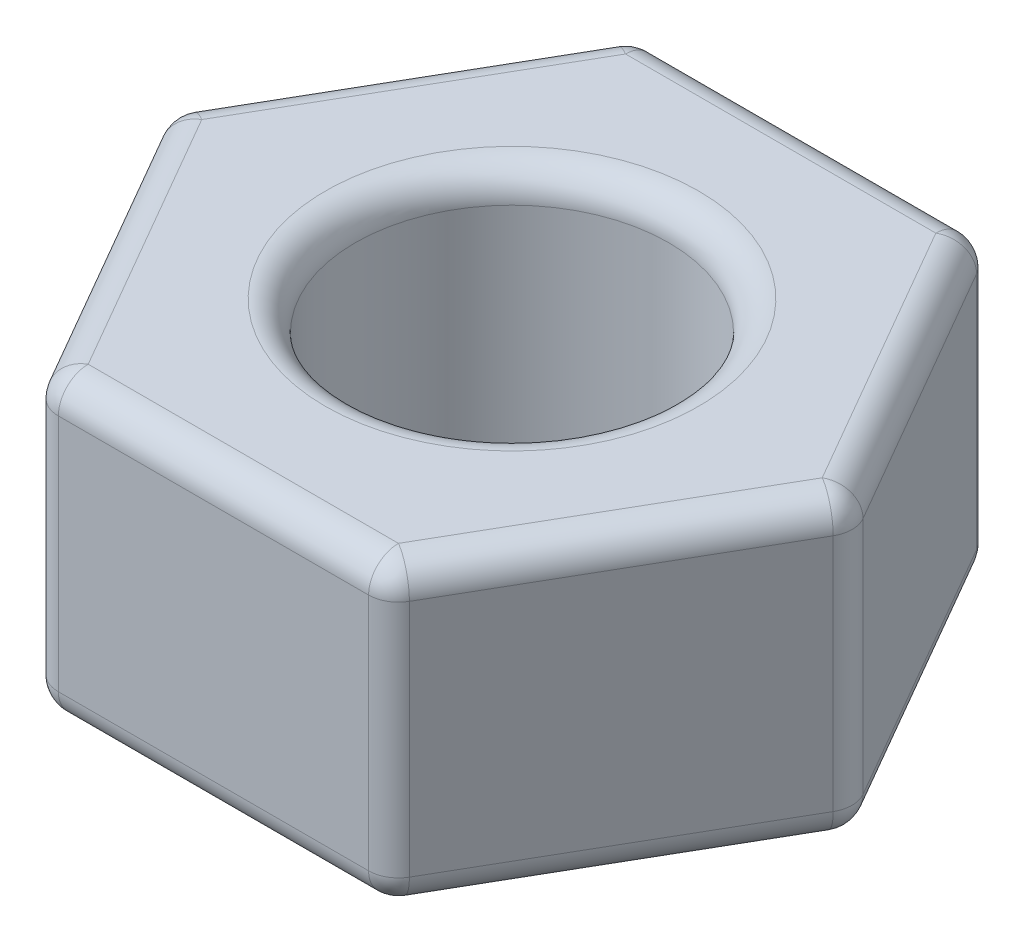
ISO-10303-21;
HEADER;
FILE_DESCRIPTION(('STEP AP214'),'2;1');
FILE_NAME('part.step','',(''),(''),'','','');
FILE_SCHEMA(('AUTOMOTIVE_DESIGN { 1 0 10303 214 1 1 1 1 }'));
ENDSEC;
DATA;
#1=APPLICATION_CONTEXT('core data for automotive mechanical design processes');
#2=APPLICATION_PROTOCOL_DEFINITION('international standard','automotive_design',2000,#1);
#3=PRODUCT_CONTEXT('',#1,'mechanical');
#4=PRODUCT('Part','Part','',(#3));
#5=PRODUCT_RELATED_PRODUCT_CATEGORY('part','',(#4));
#6=PRODUCT_DEFINITION_FORMATION('','',#4);
#7=PRODUCT_DEFINITION_CONTEXT('part definition',#1,'design');
#8=PRODUCT_DEFINITION('design','',#6,#7);
#9=PRODUCT_DEFINITION_SHAPE('','',#8);
#10=(LENGTH_UNIT() NAMED_UNIT(*) SI_UNIT(.MILLI.,.METRE.));
#11=(NAMED_UNIT(*) PLANE_ANGLE_UNIT() SI_UNIT($,.RADIAN.));
#12=(NAMED_UNIT(*) SI_UNIT($,.STERADIAN.) SOLID_ANGLE_UNIT());
#13=UNCERTAINTY_MEASURE_WITH_UNIT(LENGTH_MEASURE(1.E-05),#10,'distance_accuracy_value','');
#14=(GEOMETRIC_REPRESENTATION_CONTEXT(3) GLOBAL_UNCERTAINTY_ASSIGNED_CONTEXT((#13)) GLOBAL_UNIT_ASSIGNED_CONTEXT((#10,
#11,#12)) REPRESENTATION_CONTEXT('',''));
#15=CARTESIAN_POINT('',(0.,0.,0.));
#16=DIRECTION('',(0.,0.,1.));
#17=DIRECTION('',(1.,0.,0.));
#18=AXIS2_PLACEMENT_3D('',#15,#16,#17);
#19=CARTESIAN_POINT('',(4.61880215351701,4.,0.));
#20=DIRECTION('',(-0.866025403784439,0.,0.5));
#21=DIRECTION('',(0.5,0.,0.866025403784439));
#22=AXIS2_PLACEMENT_3D('',#19,#20,#21);
#23=PLANE('',#22);
#24=DIRECTION('',(0.,-1.,0.));
#25=VECTOR('',#24,1.);
#26=CARTESIAN_POINT('',(2.42487113059643,4.,-3.8));
#27=LINE('',#26,#25);
#28=CARTESIAN_POINT('',(2.42487113059643,0.4,-3.8));
#29=VERTEX_POINT('',#28);
#30=CARTESIAN_POINT('',(2.42487113059643,3.6,-3.8));
#31=VERTEX_POINT('',#30);
#32=EDGE_CURVE('E255',#29,#31,#27,.F.);
#33=ORIENTED_EDGE('',*,*,#32,.T.);
#34=DIRECTION('',(-0.5,0.,-0.866025403784439));
#35=VECTOR('',#34,1.);
#36=CARTESIAN_POINT('',(4.61880215351701,3.6,0.));
#37=LINE('',#36,#35);
#38=CARTESIAN_POINT('',(4.50333209967908,3.6,-0.200000000000002));
#39=VERTEX_POINT('',#38);
#40=EDGE_CURVE('E257',#31,#39,#37,.F.);
#41=ORIENTED_EDGE('',*,*,#40,.T.);
#42=DIRECTION('',(0.,-1.,0.));
#43=VECTOR('',#42,1.);
#44=CARTESIAN_POINT('',(4.50333209967908,4.,-0.200000000000002));
#45=LINE('',#44,#43);
#46=CARTESIAN_POINT('',(4.50333209967908,0.4,-0.200000000000002));
#47=VERTEX_POINT('',#46);
#48=EDGE_CURVE('E253',#39,#47,#45,.T.);
#49=ORIENTED_EDGE('',*,*,#48,.T.);
#50=DIRECTION('',(-0.5,0.,-0.866025403784439));
#51=VECTOR('',#50,1.);
#52=CARTESIAN_POINT('',(4.61880215351701,0.4,0.));
#53=LINE('',#52,#51);
#54=EDGE_CURVE('E251',#47,#29,#53,.T.);
#55=ORIENTED_EDGE('',*,*,#54,.T.);
#56=EDGE_LOOP('',(#33,#41,#49,#55));
#57=FACE_BOUND('',#56,.T.);
#58=ADVANCED_FACE('F41',(#57),#23,.F.);
#59=CARTESIAN_POINT('',(2.3094010767585,4.,-4.));
#60=DIRECTION('',(0.,0.,1.));
#61=DIRECTION('',(1.,0.,0.));
#62=AXIS2_PLACEMENT_3D('',#59,#60,#61);
#63=PLANE('',#62);
#64=DIRECTION('',(0.,-1.,0.));
#65=VECTOR('',#64,1.);
#66=CARTESIAN_POINT('',(-2.07846096908265,4.,-4.));
#67=LINE('',#66,#65);
#68=CARTESIAN_POINT('',(-2.07846096908265,0.4,-4.));
#69=VERTEX_POINT('',#68);
#70=CARTESIAN_POINT('',(-2.07846096908265,3.6,-4.));
#71=VERTEX_POINT('',#70);
#72=EDGE_CURVE('E246',#69,#71,#67,.F.);
#73=ORIENTED_EDGE('',*,*,#72,.T.);
#74=DIRECTION('',(-1.,0.,0.));
#75=VECTOR('',#74,1.);
#76=CARTESIAN_POINT('',(2.3094010767585,3.6,-4.));
#77=LINE('',#76,#75);
#78=CARTESIAN_POINT('',(2.07846096908265,3.6,-4.));
#79=VERTEX_POINT('',#78);
#80=EDGE_CURVE('E248',#71,#79,#77,.F.);
#81=ORIENTED_EDGE('',*,*,#80,.T.);
#82=DIRECTION('',(0.,-1.,0.));
#83=VECTOR('',#82,1.);
#84=CARTESIAN_POINT('',(2.07846096908265,4.,-4.));
#85=LINE('',#84,#83);
#86=CARTESIAN_POINT('',(2.07846096908265,0.4,-4.));
#87=VERTEX_POINT('',#86);
#88=EDGE_CURVE('E244',#79,#87,#85,.T.);
#89=ORIENTED_EDGE('',*,*,#88,.T.);
#90=DIRECTION('',(-1.,0.,0.));
#91=VECTOR('',#90,1.);
#92=CARTESIAN_POINT('',(2.3094010767585,0.4,-4.));
#93=LINE('',#92,#91);
#94=EDGE_CURVE('E242',#87,#69,#93,.T.);
#95=ORIENTED_EDGE('',*,*,#94,.T.);
#96=EDGE_LOOP('',(#73,#81,#89,#95));
#97=FACE_BOUND('',#96,.T.);
#98=ADVANCED_FACE('F383',(#97),#63,.F.);
#99=CARTESIAN_POINT('',(-2.3094010767585,4.,-4.));
#100=DIRECTION('',(0.866025403784439,0.,0.499999999999999));
#101=DIRECTION('',(0.5,0.,-0.866025403784439));
#102=AXIS2_PLACEMENT_3D('',#99,#100,#101);
#103=PLANE('',#102);
#104=DIRECTION('',(-0.5,0.,0.866025403784439));
#105=VECTOR('',#104,1.);
#106=CARTESIAN_POINT('',(-2.3094010767585,0.4,-4.));
#107=LINE('',#106,#105);
#108=CARTESIAN_POINT('',(-2.42487113059643,0.4,-3.8));
#109=VERTEX_POINT('',#108);
#110=CARTESIAN_POINT('',(-4.50333209967908,0.4,-0.199999999999999));
#111=VERTEX_POINT('',#110);
#112=EDGE_CURVE('E211',#109,#111,#107,.T.);
#113=ORIENTED_EDGE('',*,*,#112,.T.);
#114=DIRECTION('',(0.,-1.,0.));
#115=VECTOR('',#114,1.);
#116=CARTESIAN_POINT('',(-4.50333209967908,4.,-0.199999999999999));
#117=LINE('',#116,#115);
#118=CARTESIAN_POINT('',(-4.50333209967908,3.6,-0.199999999999999));
#119=VERTEX_POINT('',#118);
#120=EDGE_CURVE('E217',#111,#119,#117,.F.);
#121=ORIENTED_EDGE('',*,*,#120,.T.);
#122=DIRECTION('',(-0.5,0.,0.866025403784439));
#123=VECTOR('',#122,1.);
#124=CARTESIAN_POINT('',(-2.3094010767585,3.6,-4.));
#125=LINE('',#124,#123);
#126=CARTESIAN_POINT('',(-2.42487113059643,3.6,-3.8));
#127=VERTEX_POINT('',#126);
#128=EDGE_CURVE('E215',#119,#127,#125,.F.);
#129=ORIENTED_EDGE('',*,*,#128,.T.);
#130=DIRECTION('',(0.,-1.,0.));
#131=VECTOR('',#130,1.);
#132=CARTESIAN_POINT('',(-2.42487113059643,4.,-3.8));
#133=LINE('',#132,#131);
#134=EDGE_CURVE('E213',#127,#109,#133,.T.);
#135=ORIENTED_EDGE('',*,*,#134,.T.);
#136=EDGE_LOOP('',(#113,#121,#129,#135));
#137=FACE_BOUND('',#136,.T.);
#138=ADVANCED_FACE('F446',(#137),#103,.F.);
#139=CARTESIAN_POINT('',(-4.618802153517,4.,0.));
#140=DIRECTION('',(0.866025403784439,0.,-0.5));
#141=DIRECTION('',(-0.5,0.,-0.866025403784439));
#142=AXIS2_PLACEMENT_3D('',#139,#140,#141);
#143=PLANE('',#142);
#144=DIRECTION('',(0.,-1.,0.));
#145=VECTOR('',#144,1.);
#146=CARTESIAN_POINT('',(-2.42487113059643,4.,3.8));
#147=LINE('',#146,#145);
#148=CARTESIAN_POINT('',(-2.42487113059643,0.4,3.8));
#149=VERTEX_POINT('',#148);
#150=CARTESIAN_POINT('',(-2.42487113059643,3.6,3.8));
#151=VERTEX_POINT('',#150);
#152=EDGE_CURVE('E172',#149,#151,#147,.F.);
#153=ORIENTED_EDGE('',*,*,#152,.T.);
#154=DIRECTION('',(0.5,0.,0.866025403784439));
#155=VECTOR('',#154,1.);
#156=CARTESIAN_POINT('',(-4.618802153517,3.6,0.));
#157=LINE('',#156,#155);
#158=CARTESIAN_POINT('',(-4.50333209967908,3.6,0.200000000000001));
#159=VERTEX_POINT('',#158);
#160=EDGE_CURVE('E209',#151,#159,#157,.F.);
#161=ORIENTED_EDGE('',*,*,#160,.T.);
#162=DIRECTION('',(0.,-1.,0.));
#163=VECTOR('',#162,1.);
#164=CARTESIAN_POINT('',(-4.50333209967908,4.,0.200000000000001));
#165=LINE('',#164,#163);
#166=CARTESIAN_POINT('',(-4.50333209967908,0.4,0.200000000000001));
#167=VERTEX_POINT('',#166);
#168=EDGE_CURVE('E202',#159,#167,#165,.T.);
#169=ORIENTED_EDGE('',*,*,#168,.T.);
#170=DIRECTION('',(0.5,0.,0.866025403784439));
#171=VECTOR('',#170,1.);
#172=CARTESIAN_POINT('',(-4.618802153517,0.4,0.));
#173=LINE('',#172,#171);
#174=EDGE_CURVE('E200',#167,#149,#173,.T.);
#175=ORIENTED_EDGE('',*,*,#174,.T.);
#176=EDGE_LOOP('',(#153,#161,#169,#175));
#177=FACE_BOUND('',#176,.T.);
#178=ADVANCED_FACE('F799',(#177),#143,.F.);
#179=CARTESIAN_POINT('',(-2.3094010767585,4.,4.));
#180=DIRECTION('',(0.,0.,-1.));
#181=DIRECTION('',(-1.,0.,0.));
#182=AXIS2_PLACEMENT_3D('',#179,#180,#181);
#183=PLANE('',#182);
#184=DIRECTION('',(1.,0.,0.));
#185=VECTOR('',#184,1.);
#186=CARTESIAN_POINT('',(-2.3094010767585,3.6,4.));
#187=LINE('',#186,#185);
#188=CARTESIAN_POINT('',(2.07846096908265,3.6,4.));
#189=VERTEX_POINT('',#188);
#190=CARTESIAN_POINT('',(-2.07846096908265,3.6,4.));
#191=VERTEX_POINT('',#190);
#192=EDGE_CURVE('E198',#189,#191,#187,.F.);
#193=ORIENTED_EDGE('',*,*,#192,.T.);
#194=DIRECTION('',(0.,-1.,0.));
#195=VECTOR('',#194,1.);
#196=CARTESIAN_POINT('',(-2.07846096908265,4.,4.));
#197=LINE('',#196,#195);
#198=CARTESIAN_POINT('',(-2.07846096908265,0.4,4.));
#199=VERTEX_POINT('',#198);
#200=EDGE_CURVE('E170',#191,#199,#197,.T.);
#201=ORIENTED_EDGE('',*,*,#200,.T.);
#202=DIRECTION('',(1.,0.,0.));
#203=VECTOR('',#202,1.);
#204=CARTESIAN_POINT('',(-2.3094010767585,0.4,4.));
#205=LINE('',#204,#203);
#206=CARTESIAN_POINT('',(2.07846096908265,0.4,4.));
#207=VERTEX_POINT('',#206);
#208=EDGE_CURVE('E188',#199,#207,#205,.T.);
#209=ORIENTED_EDGE('',*,*,#208,.T.);
#210=DIRECTION('',(0.,-1.,0.));
#211=VECTOR('',#210,1.);
#212=CARTESIAN_POINT('',(2.07846096908265,4.,4.));
#213=LINE('',#212,#211);
#214=EDGE_CURVE('E194',#207,#189,#213,.F.);
#215=ORIENTED_EDGE('',*,*,#214,.T.);
#216=EDGE_LOOP('',(#193,#201,#209,#215));
#217=FACE_BOUND('',#216,.T.);
#218=ADVANCED_FACE('F196',(#217),#183,.F.);
#219=CARTESIAN_POINT('',(2.3094010767585,4.,4.));
#220=DIRECTION('',(-0.866025403784439,0.,-0.5));
#221=DIRECTION('',(-0.5,0.,0.866025403784439));
#222=AXIS2_PLACEMENT_3D('',#219,#220,#221);
#223=PLANE('',#222);
#224=DIRECTION('',(0.5,0.,-0.866025403784439));
#225=VECTOR('',#224,1.);
#226=CARTESIAN_POINT('',(2.3094010767585,3.6,4.));
#227=LINE('',#226,#225);
#228=CARTESIAN_POINT('',(4.50333209967908,3.6,0.199999999999999));
#229=VERTEX_POINT('',#228);
#230=CARTESIAN_POINT('',(2.42487113059643,3.6,3.8));
#231=VERTEX_POINT('',#230);
#232=EDGE_CURVE('E264',#229,#231,#227,.F.);
#233=ORIENTED_EDGE('',*,*,#232,.T.);
#234=DIRECTION('',(0.,-1.,0.));
#235=VECTOR('',#234,1.);
#236=CARTESIAN_POINT('',(2.42487113059643,4.,3.8));
#237=LINE('',#236,#235);
#238=CARTESIAN_POINT('',(2.42487113059643,0.4,3.8));
#239=VERTEX_POINT('',#238);
#240=EDGE_CURVE('E266',#231,#239,#237,.T.);
#241=ORIENTED_EDGE('',*,*,#240,.T.);
#242=DIRECTION('',(0.5,0.,-0.866025403784439));
#243=VECTOR('',#242,1.);
#244=CARTESIAN_POINT('',(2.3094010767585,0.4,4.));
#245=LINE('',#244,#243);
#246=CARTESIAN_POINT('',(4.50333209967908,0.4,0.199999999999999));
#247=VERTEX_POINT('',#246);
#248=EDGE_CURVE('E260',#239,#247,#245,.T.);
#249=ORIENTED_EDGE('',*,*,#248,.T.);
#250=DIRECTION('',(0.,-1.,0.));
#251=VECTOR('',#250,1.);
#252=CARTESIAN_POINT('',(4.50333209967908,4.,0.199999999999999));
#253=LINE('',#252,#251);
#254=EDGE_CURVE('E262',#247,#229,#253,.F.);
#255=ORIENTED_EDGE('',*,*,#254,.T.);
#256=EDGE_LOOP('',(#233,#241,#249,#255));
#257=FACE_BOUND('',#256,.T.);
#258=ADVANCED_FACE('F782',(#257),#223,.F.);
#259=CARTESIAN_POINT('',(0.,4.,0.));
#260=DIRECTION('',(0.,1.,0.));
#261=DIRECTION('',(0.,0.,1.));
#262=AXIS2_PLACEMENT_3D('',#259,#260,#261);
#263=PLANE('',#262);
#264=CARTESIAN_POINT('',(0.,4.,0.));
#265=DIRECTION('',(0.,1.,0.));
#266=DIRECTION('',(0.,0.,1.));
#267=AXIS2_PLACEMENT_3D('',#264,#265,#266);
#268=CIRCLE('',#267,2.5);
#269=CARTESIAN_POINT('',(0.,4.,2.5));
#270=VERTEX_POINT('',#269);
#271=EDGE_CURVE('E233',#270,#270,#268,.F.);
#272=ORIENTED_EDGE('',*,*,#271,.T.);
#273=EDGE_LOOP('',(#272));
#274=FACE_BOUND('',#273,.T.);
#275=DIRECTION('',(0.5,0.,0.866025403784439));
#276=VECTOR('',#275,1.);
#277=CARTESIAN_POINT('',(-1.96299091524473,4.,3.8));
#278=LINE('',#277,#276);
#279=CARTESIAN_POINT('',(-4.1569219381653,4.,0.));
#280=VERTEX_POINT('',#279);
#281=CARTESIAN_POINT('',(-2.07846096908265,4.,3.6));
#282=VERTEX_POINT('',#281);
#283=EDGE_CURVE('E228',#280,#282,#278,.T.);
#284=ORIENTED_EDGE('',*,*,#283,.T.);
#285=DIRECTION('',(1.,0.,0.));
#286=VECTOR('',#285,1.);
#287=CARTESIAN_POINT('',(2.3094010767585,4.,3.6));
#288=LINE('',#287,#286);
#289=CARTESIAN_POINT('',(2.07846096908265,4.,3.6));
#290=VERTEX_POINT('',#289);
#291=EDGE_CURVE('E230',#282,#290,#288,.T.);
#292=ORIENTED_EDGE('',*,*,#291,.T.);
#293=DIRECTION('',(0.5,0.,-0.866025403784439));
#294=VECTOR('',#293,1.);
#295=CARTESIAN_POINT('',(4.27239199200323,4.,-0.200000000000002));
#296=LINE('',#295,#294);
#297=CARTESIAN_POINT('',(4.15692193816531,4.,0.));
#298=VERTEX_POINT('',#297);
#299=EDGE_CURVE('E220',#290,#298,#296,.T.);
#300=ORIENTED_EDGE('',*,*,#299,.T.);
#301=DIRECTION('',(-0.5,0.,-0.866025403784439));
#302=VECTOR('',#301,1.);
#303=CARTESIAN_POINT('',(1.96299091524473,4.,-3.8));
#304=LINE('',#303,#302);
#305=CARTESIAN_POINT('',(2.07846096908265,4.,-3.6));
#306=VERTEX_POINT('',#305);
#307=EDGE_CURVE('E222',#298,#306,#304,.T.);
#308=ORIENTED_EDGE('',*,*,#307,.T.);
#309=DIRECTION('',(-1.,0.,0.));
#310=VECTOR('',#309,1.);
#311=CARTESIAN_POINT('',(-2.3094010767585,4.,-3.6));
#312=LINE('',#311,#310);
#313=CARTESIAN_POINT('',(-2.07846096908265,4.,-3.6));
#314=VERTEX_POINT('',#313);
#315=EDGE_CURVE('E224',#306,#314,#312,.T.);
#316=ORIENTED_EDGE('',*,*,#315,.T.);
#317=DIRECTION('',(-0.5,0.,0.866025403784439));
#318=VECTOR('',#317,1.);
#319=CARTESIAN_POINT('',(-4.27239199200323,4.,0.200000000000002));
#320=LINE('',#319,#318);
#321=EDGE_CURVE('E226',#314,#280,#320,.T.);
#322=ORIENTED_EDGE('',*,*,#321,.T.);
#323=EDGE_LOOP('',(#284,#292,#300,#308,#316,#322));
#324=FACE_BOUND('',#323,.T.);
#325=ADVANCED_FACE('F404',(#274,#324),#263,.T.);
#326=CARTESIAN_POINT('',(0.,0.,0.));
#327=DIRECTION('',(0.,1.,0.));
#328=DIRECTION('',(0.,0.,1.));
#329=AXIS2_PLACEMENT_3D('',#326,#327,#328);
#330=PLANE('',#329);
#331=DIRECTION('',(-0.5,0.,0.866025403784439));
#332=VECTOR('',#331,1.);
#333=CARTESIAN_POINT('',(-3.11769145362398,0.,-1.8));
#334=LINE('',#333,#332);
#335=CARTESIAN_POINT('',(-4.1569219381653,0.,0.));
#336=VERTEX_POINT('',#335);
#337=CARTESIAN_POINT('',(-2.07846096908265,0.,-3.6));
#338=VERTEX_POINT('',#337);
#339=EDGE_CURVE('E50',#336,#338,#334,.F.);
#340=ORIENTED_EDGE('',*,*,#339,.T.);
#341=DIRECTION('',(-1.,0.,0.));
#342=VECTOR('',#341,1.);
#343=CARTESIAN_POINT('',(0.,0.,-3.6));
#344=LINE('',#343,#342);
#345=CARTESIAN_POINT('',(2.07846096908265,0.,-3.6));
#346=VERTEX_POINT('',#345);
#347=EDGE_CURVE('E11',#338,#346,#344,.F.);
#348=ORIENTED_EDGE('',*,*,#347,.T.);
#349=DIRECTION('',(-0.5,0.,-0.866025403784439));
#350=VECTOR('',#349,1.);
#351=CARTESIAN_POINT('',(3.11769145362398,0.,-1.8));
#352=LINE('',#351,#350);
#353=CARTESIAN_POINT('',(4.15692193816531,0.,0.));
#354=VERTEX_POINT('',#353);
#355=EDGE_CURVE('E272',#346,#354,#352,.F.);
#356=ORIENTED_EDGE('',*,*,#355,.T.);
#357=DIRECTION('',(0.5,0.,-0.866025403784439));
#358=VECTOR('',#357,1.);
#359=CARTESIAN_POINT('',(3.11769145362398,0.,1.8));
#360=LINE('',#359,#358);
#361=CARTESIAN_POINT('',(2.07846096908265,0.,3.6));
#362=VERTEX_POINT('',#361);
#363=EDGE_CURVE('E274',#354,#362,#360,.F.);
#364=ORIENTED_EDGE('',*,*,#363,.T.);
#365=DIRECTION('',(1.,0.,0.));
#366=VECTOR('',#365,1.);
#367=CARTESIAN_POINT('',(0.,0.,3.6));
#368=LINE('',#367,#366);
#369=CARTESIAN_POINT('',(-2.07846096908265,0.,3.6));
#370=VERTEX_POINT('',#369);
#371=EDGE_CURVE('E276',#362,#370,#368,.F.);
#372=ORIENTED_EDGE('',*,*,#371,.T.);
#373=DIRECTION('',(0.5,0.,0.866025403784439));
#374=VECTOR('',#373,1.);
#375=CARTESIAN_POINT('',(-3.11769145362398,0.,1.8));
#376=LINE('',#375,#374);
#377=EDGE_CURVE('E61',#370,#336,#376,.F.);
#378=ORIENTED_EDGE('',*,*,#377,.T.);
#379=EDGE_LOOP('',(#340,#348,#356,#364,#372,#378));
#380=FACE_BOUND('',#379,.T.);
#381=CARTESIAN_POINT('',(0.,0.,0.));
#382=DIRECTION('',(0.,1.,0.));
#383=DIRECTION('',(0.,0.,1.));
#384=AXIS2_PLACEMENT_3D('',#381,#382,#383);
#385=CIRCLE('',#384,2.5);
#386=CARTESIAN_POINT('',(0.,0.,2.5));
#387=VERTEX_POINT('',#386);
#388=EDGE_CURVE('E269',#387,#387,#385,.T.);
#389=ORIENTED_EDGE('',*,*,#388,.T.);
#390=EDGE_LOOP('',(#389));
#391=FACE_BOUND('',#390,.T.);
#392=ADVANCED_FACE('F431',(#380,#391),#330,.F.);
#393=CARTESIAN_POINT('',(0.,0.,0.));
#394=DIRECTION('',(0.,-1.,0.));
#395=DIRECTION('',(0.,0.,-1.));
#396=AXIS2_PLACEMENT_3D('',#393,#394,#395);
#397=CYLINDRICAL_SURFACE('',#396,2.1);
#398=CARTESIAN_POINT('',(0.,3.6,0.));
#399=DIRECTION('',(0.,1.,0.));
#400=DIRECTION('',(0.,0.,1.));
#401=AXIS2_PLACEMENT_3D('',#398,#399,#400);
#402=CIRCLE('',#401,2.1);
#403=CARTESIAN_POINT('',(0.,3.6,2.1));
#404=VERTEX_POINT('',#403);
#405=EDGE_CURVE('E239',#404,#404,#402,.T.);
#406=ORIENTED_EDGE('',*,*,#405,.T.);
#407=EDGE_LOOP('',(#406));
#408=FACE_BOUND('',#407,.T.);
#409=CARTESIAN_POINT('',(0.,0.4,0.));
#410=DIRECTION('',(0.,1.,0.));
#411=DIRECTION('',(0.,0.,1.));
#412=AXIS2_PLACEMENT_3D('',#409,#410,#411);
#413=CIRCLE('',#412,2.1);
#414=CARTESIAN_POINT('',(0.,0.4,2.1));
#415=VERTEX_POINT('',#414);
#416=EDGE_CURVE('E236',#415,#415,#413,.F.);
#417=ORIENTED_EDGE('',*,*,#416,.T.);
#418=EDGE_LOOP('',(#417));
#419=FACE_BOUND('',#418,.T.);
#420=ADVANCED_FACE('F628',(#408,#419),#397,.F.);
#421=CARTESIAN_POINT('',(2.07846096908265,4.,-3.6));
#422=DIRECTION('',(0.,-1.,0.));
#423=DIRECTION('',(0.,0.,-1.));
#424=AXIS2_PLACEMENT_3D('',#421,#422,#423);
#425=CYLINDRICAL_SURFACE('',#424,0.4);
#426=CARTESIAN_POINT('',(2.07846096908265,3.6,-3.6));
#427=DIRECTION('',(0.,1.,0.));
#428=DIRECTION('',(0.,0.,1.));
#429=AXIS2_PLACEMENT_3D('',#426,#427,#428);
#430=CIRCLE('',#429,0.4);
#431=EDGE_CURVE('E45',#31,#79,#430,.T.);
#432=ORIENTED_EDGE('',*,*,#431,.F.);
#433=ORIENTED_EDGE('',*,*,#32,.F.);
#434=CARTESIAN_POINT('',(2.07846096908265,0.4,-3.6));
#435=DIRECTION('',(0.,-1.,0.));
#436=DIRECTION('',(0.,0.,-1.));
#437=AXIS2_PLACEMENT_3D('',#434,#435,#436);
#438=CIRCLE('',#437,0.4);
#439=EDGE_CURVE('E363',#87,#29,#438,.T.);
#440=ORIENTED_EDGE('',*,*,#439,.F.);
#441=ORIENTED_EDGE('',*,*,#88,.F.);
#442=EDGE_LOOP('',(#432,#433,#440,#441));
#443=FACE_BOUND('',#442,.T.);
#444=ADVANCED_FACE('F380',(#443),#425,.T.);
#445=CARTESIAN_POINT('',(2.07846096908265,3.6,-3.6));
#446=DIRECTION('',(0.,0.,1.));
#447=DIRECTION('',(1.,0.,0.));
#448=AXIS2_PLACEMENT_3D('',#445,#446,#447);
#449=SPHERICAL_SURFACE('',#448,0.4);
#450=CARTESIAN_POINT('',(2.07846096908265,3.6,-3.6));
#451=DIRECTION('',(-0.5,0.,-0.866025403784439));
#452=DIRECTION('',(-0.866025403784439,0.,0.5));
#453=AXIS2_PLACEMENT_3D('',#450,#451,#452);
#454=CIRCLE('',#453,0.4);
#455=EDGE_CURVE('E359',#31,#306,#454,.F.);
#456=ORIENTED_EDGE('',*,*,#455,.F.);
#457=ORIENTED_EDGE('',*,*,#431,.T.);
#458=CARTESIAN_POINT('',(2.07846096908265,3.6,-3.6));
#459=DIRECTION('',(1.,0.,0.));
#460=DIRECTION('',(0.,1.,0.));
#461=AXIS2_PLACEMENT_3D('',#458,#459,#460);
#462=CIRCLE('',#461,0.4);
#463=EDGE_CURVE('E362',#306,#79,#462,.F.);
#464=ORIENTED_EDGE('',*,*,#463,.F.);
#465=EDGE_LOOP('',(#456,#457,#464));
#466=FACE_BOUND('',#465,.T.);
#467=ADVANCED_FACE('F375',(#466),#449,.T.);
#468=CARTESIAN_POINT('',(2.07846096908265,0.4,-3.6));
#469=DIRECTION('',(0.,0.,1.));
#470=DIRECTION('',(1.,0.,0.));
#471=AXIS2_PLACEMENT_3D('',#468,#469,#470);
#472=SPHERICAL_SURFACE('',#471,0.4);
#473=CARTESIAN_POINT('',(2.07846096908265,0.4,-3.6));
#474=DIRECTION('',(1.,0.,0.));
#475=DIRECTION('',(0.,0.,-1.));
#476=AXIS2_PLACEMENT_3D('',#473,#474,#475);
#477=CIRCLE('',#476,0.4);
#478=EDGE_CURVE('E353',#87,#346,#477,.F.);
#479=ORIENTED_EDGE('',*,*,#478,.F.);
#480=ORIENTED_EDGE('',*,*,#439,.T.);
#481=CARTESIAN_POINT('',(2.07846096908265,0.4,-3.6));
#482=DIRECTION('',(-0.5,0.,-0.866025403784439));
#483=DIRECTION('',(-0.866025403784439,0.,0.5));
#484=AXIS2_PLACEMENT_3D('',#481,#482,#483);
#485=CIRCLE('',#484,0.4);
#486=EDGE_CURVE('E356',#346,#29,#485,.F.);
#487=ORIENTED_EDGE('',*,*,#486,.F.);
#488=EDGE_LOOP('',(#479,#480,#487));
#489=FACE_BOUND('',#488,.T.);
#490=ADVANCED_FACE('F433',(#489),#472,.T.);
#491=CARTESIAN_POINT('',(0.,3.6,-3.6));
#492=DIRECTION('',(1.,0.,0.));
#493=DIRECTION('',(0.,0.,-1.));
#494=AXIS2_PLACEMENT_3D('',#491,#492,#493);
#495=CYLINDRICAL_SURFACE('',#494,0.4);
#496=ORIENTED_EDGE('',*,*,#463,.T.);
#497=ORIENTED_EDGE('',*,*,#80,.F.);
#498=CARTESIAN_POINT('',(-2.07846096908265,3.6,-3.6));
#499=DIRECTION('',(-1.,0.,0.));
#500=DIRECTION('',(0.,0.,1.));
#501=AXIS2_PLACEMENT_3D('',#498,#499,#500);
#502=CIRCLE('',#501,0.4);
#503=EDGE_CURVE('E347',#314,#71,#502,.T.);
#504=ORIENTED_EDGE('',*,*,#503,.F.);
#505=ORIENTED_EDGE('',*,*,#315,.F.);
#506=EDGE_LOOP('',(#496,#497,#504,#505));
#507=FACE_BOUND('',#506,.T.);
#508=ADVANCED_FACE('F388',(#507),#495,.T.);
#509=CARTESIAN_POINT('',(3.11769145362398,3.6,-1.8));
#510=DIRECTION('',(0.5,0.,0.866025403784439));
#511=DIRECTION('',(0.866025403784439,0.,-0.5));
#512=AXIS2_PLACEMENT_3D('',#509,#510,#511);
#513=CYLINDRICAL_SURFACE('',#512,0.4);
#514=ORIENTED_EDGE('',*,*,#455,.T.);
#515=ORIENTED_EDGE('',*,*,#307,.F.);
#516=CARTESIAN_POINT('',(4.15692193816531,3.6,0.));
#517=DIRECTION('',(0.5,0.,0.866025403784438));
#518=DIRECTION('',(0.866025403784439,0.,-0.5));
#519=AXIS2_PLACEMENT_3D('',#516,#517,#518);
#520=CIRCLE('',#519,0.4);
#521=EDGE_CURVE('E344',#39,#298,#520,.T.);
#522=ORIENTED_EDGE('',*,*,#521,.F.);
#523=ORIENTED_EDGE('',*,*,#40,.F.);
#524=EDGE_LOOP('',(#514,#515,#522,#523));
#525=FACE_BOUND('',#524,.T.);
#526=ADVANCED_FACE('F411',(#525),#513,.T.);
#527=CARTESIAN_POINT('',(4.15692193816531,4.,0.));
#528=DIRECTION('',(0.,-1.,0.));
#529=DIRECTION('',(0.,0.,-1.));
#530=AXIS2_PLACEMENT_3D('',#527,#528,#529);
#531=CYLINDRICAL_SURFACE('',#530,0.4);
#532=CARTESIAN_POINT('',(4.15692193816531,0.4,0.));
#533=DIRECTION('',(0.,-1.,0.));
#534=DIRECTION('',(0.,0.,-1.));
#535=AXIS2_PLACEMENT_3D('',#532,#533,#534);
#536=CIRCLE('',#535,0.4);
#537=EDGE_CURVE('E339',#47,#247,#536,.T.);
#538=ORIENTED_EDGE('',*,*,#537,.F.);
#539=ORIENTED_EDGE('',*,*,#48,.F.);
#540=CARTESIAN_POINT('',(4.15692193816531,3.6,0.));
#541=DIRECTION('',(0.,1.,0.));
#542=DIRECTION('',(0.,0.,1.));
#543=AXIS2_PLACEMENT_3D('',#540,#541,#542);
#544=CIRCLE('',#543,0.4);
#545=EDGE_CURVE('E342',#229,#39,#544,.T.);
#546=ORIENTED_EDGE('',*,*,#545,.F.);
#547=ORIENTED_EDGE('',*,*,#254,.F.);
#548=EDGE_LOOP('',(#538,#539,#546,#547));
#549=FACE_BOUND('',#548,.T.);
#550=ADVANCED_FACE('F422',(#549),#531,.T.);
#551=CARTESIAN_POINT('',(4.27239199200323,0.4,0.199999999999999));
#552=DIRECTION('',(-0.5,0.,-0.866025403784439));
#553=DIRECTION('',(-0.866025403784439,0.,0.5));
#554=AXIS2_PLACEMENT_3D('',#551,#552,#553);
#555=CYLINDRICAL_SURFACE('',#554,0.4);
#556=ORIENTED_EDGE('',*,*,#486,.T.);
#557=ORIENTED_EDGE('',*,*,#54,.F.);
#558=CARTESIAN_POINT('',(4.15692193816531,0.4,0.));
#559=DIRECTION('',(0.500000000000001,0.,0.866025403784438));
#560=DIRECTION('',(0.866025403784438,0.,-0.500000000000001));
#561=AXIS2_PLACEMENT_3D('',#558,#559,#560);
#562=CIRCLE('',#561,0.4);
#563=EDGE_CURVE('E336',#354,#47,#562,.T.);
#564=ORIENTED_EDGE('',*,*,#563,.F.);
#565=ORIENTED_EDGE('',*,*,#355,.F.);
#566=EDGE_LOOP('',(#556,#557,#564,#565));
#567=FACE_BOUND('',#566,.T.);
#568=ADVANCED_FACE('F418',(#567),#555,.T.);
#569=CARTESIAN_POINT('',(2.3094010767585,0.4,-3.6));
#570=DIRECTION('',(-1.,0.,0.));
#571=DIRECTION('',(0.,0.,1.));
#572=AXIS2_PLACEMENT_3D('',#569,#570,#571);
#573=CYLINDRICAL_SURFACE('',#572,0.4);
#574=ORIENTED_EDGE('',*,*,#478,.T.);
#575=ORIENTED_EDGE('',*,*,#347,.F.);
#576=CARTESIAN_POINT('',(-2.07846096908265,0.4,-3.6));
#577=DIRECTION('',(-1.,0.,0.));
#578=DIRECTION('',(0.,0.,1.));
#579=AXIS2_PLACEMENT_3D('',#576,#577,#578);
#580=CIRCLE('',#579,0.4);
#581=EDGE_CURVE('E333',#69,#338,#580,.T.);
#582=ORIENTED_EDGE('',*,*,#581,.F.);
#583=ORIENTED_EDGE('',*,*,#94,.F.);
#584=EDGE_LOOP('',(#574,#575,#582,#583));
#585=FACE_BOUND('',#584,.T.);
#586=ADVANCED_FACE('F436',(#585),#573,.T.);
#587=CARTESIAN_POINT('',(-2.07846096908265,4.,-3.6));
#588=DIRECTION('',(0.,-1.,0.));
#589=DIRECTION('',(0.,0.,-1.));
#590=AXIS2_PLACEMENT_3D('',#587,#588,#589);
#591=CYLINDRICAL_SURFACE('',#590,0.4);
#592=CARTESIAN_POINT('',(-2.07846096908265,3.6,-3.6));
#593=DIRECTION('',(0.,1.,0.));
#594=DIRECTION('',(0.,0.,1.));
#595=AXIS2_PLACEMENT_3D('',#592,#593,#594);
#596=CIRCLE('',#595,0.4);
#597=EDGE_CURVE('E350',#71,#127,#596,.T.);
#598=ORIENTED_EDGE('',*,*,#597,.F.);
#599=ORIENTED_EDGE('',*,*,#72,.F.);
#600=CARTESIAN_POINT('',(-2.07846096908265,0.4,-3.6));
#601=DIRECTION('',(0.,-1.,0.));
#602=DIRECTION('',(0.,0.,-1.));
#603=AXIS2_PLACEMENT_3D('',#600,#601,#602);
#604=CIRCLE('',#603,0.4);
#605=EDGE_CURVE('E330',#109,#69,#604,.T.);
#606=ORIENTED_EDGE('',*,*,#605,.F.);
#607=ORIENTED_EDGE('',*,*,#134,.F.);
#608=EDGE_LOOP('',(#598,#599,#606,#607));
#609=FACE_BOUND('',#608,.T.);
#610=ADVANCED_FACE('F392',(#609),#591,.T.);
#611=CARTESIAN_POINT('',(-2.07846096908265,3.6,-3.6));
#612=DIRECTION('',(0.,0.,1.));
#613=DIRECTION('',(1.,0.,0.));
#614=AXIS2_PLACEMENT_3D('',#611,#612,#613);
#615=SPHERICAL_SURFACE('',#614,0.4);
#616=ORIENTED_EDGE('',*,*,#503,.T.);
#617=ORIENTED_EDGE('',*,*,#597,.T.);
#618=CARTESIAN_POINT('',(-2.07846096908265,3.6,-3.6));
#619=DIRECTION('',(0.499999999999999,0.,-0.866025403784439));
#620=DIRECTION('',(-0.866025403784439,0.,-0.499999999999999));
#621=AXIS2_PLACEMENT_3D('',#618,#619,#620);
#622=CIRCLE('',#621,0.4);
#623=EDGE_CURVE('E327',#314,#127,#622,.F.);
#624=ORIENTED_EDGE('',*,*,#623,.F.);
#625=EDGE_LOOP('',(#616,#617,#624));
#626=FACE_BOUND('',#625,.T.);
#627=ADVANCED_FACE('F396',(#626),#615,.T.);
#628=CARTESIAN_POINT('',(4.15692193816531,3.6,0.));
#629=DIRECTION('',(0.,0.,1.));
#630=DIRECTION('',(1.,0.,0.));
#631=AXIS2_PLACEMENT_3D('',#628,#629,#630);
#632=SPHERICAL_SURFACE('',#631,0.4);
#633=ORIENTED_EDGE('',*,*,#545,.T.);
#634=ORIENTED_EDGE('',*,*,#521,.T.);
#635=CARTESIAN_POINT('',(4.15692193816531,3.6,0.));
#636=DIRECTION('',(0.499999999999999,0.,-0.866025403784439));
#637=DIRECTION('',(-0.866025403784439,0.,-0.499999999999999));
#638=AXIS2_PLACEMENT_3D('',#635,#636,#637);
#639=CIRCLE('',#638,0.4);
#640=EDGE_CURVE('E324',#229,#298,#639,.F.);
#641=ORIENTED_EDGE('',*,*,#640,.F.);
#642=EDGE_LOOP('',(#633,#634,#641));
#643=FACE_BOUND('',#642,.T.);
#644=ADVANCED_FACE('F474',(#643),#632,.T.);
#645=CARTESIAN_POINT('',(4.15692193816531,0.4,0.));
#646=DIRECTION('',(0.,0.,1.));
#647=DIRECTION('',(1.,0.,0.));
#648=AXIS2_PLACEMENT_3D('',#645,#646,#647);
#649=SPHERICAL_SURFACE('',#648,0.4);
#650=ORIENTED_EDGE('',*,*,#563,.T.);
#651=ORIENTED_EDGE('',*,*,#537,.T.);
#652=CARTESIAN_POINT('',(4.15692193816531,0.4,0.));
#653=DIRECTION('',(0.5,0.,-0.866025403784439));
#654=DIRECTION('',(-0.866025403784439,0.,-0.5));
#655=AXIS2_PLACEMENT_3D('',#652,#653,#654);
#656=CIRCLE('',#655,0.4);
#657=EDGE_CURVE('E321',#354,#247,#656,.F.);
#658=ORIENTED_EDGE('',*,*,#657,.F.);
#659=EDGE_LOOP('',(#650,#651,#658));
#660=FACE_BOUND('',#659,.T.);
#661=ADVANCED_FACE('F425',(#660),#649,.T.);
#662=CARTESIAN_POINT('',(-2.07846096908265,0.4,-3.6));
#663=DIRECTION('',(0.,0.,1.));
#664=DIRECTION('',(1.,0.,0.));
#665=AXIS2_PLACEMENT_3D('',#662,#663,#664);
#666=SPHERICAL_SURFACE('',#665,0.4);
#667=ORIENTED_EDGE('',*,*,#605,.T.);
#668=ORIENTED_EDGE('',*,*,#581,.T.);
#669=CARTESIAN_POINT('',(-2.07846096908265,0.4,-3.6));
#670=DIRECTION('',(0.499999999999999,0.,-0.866025403784439));
#671=DIRECTION('',(-0.866025403784439,0.,-0.499999999999999));
#672=AXIS2_PLACEMENT_3D('',#669,#670,#671);
#673=CIRCLE('',#672,0.4);
#674=EDGE_CURVE('E318',#109,#338,#673,.F.);
#675=ORIENTED_EDGE('',*,*,#674,.F.);
#676=EDGE_LOOP('',(#667,#668,#675));
#677=FACE_BOUND('',#676,.T.);
#678=ADVANCED_FACE('F439',(#677),#666,.T.);
#679=CARTESIAN_POINT('',(-3.11769145362398,3.6,-1.8));
#680=DIRECTION('',(0.5,0.,-0.866025403784439));
#681=DIRECTION('',(-0.866025403784439,0.,-0.499999999999999));
#682=AXIS2_PLACEMENT_3D('',#679,#680,#681);
#683=CYLINDRICAL_SURFACE('',#682,0.4);
#684=ORIENTED_EDGE('',*,*,#623,.T.);
#685=ORIENTED_EDGE('',*,*,#128,.F.);
#686=CARTESIAN_POINT('',(-4.1569219381653,3.6,0.));
#687=DIRECTION('',(-0.499999999999999,0.,0.866025403784439));
#688=DIRECTION('',(0.86602540378444,0.,0.499999999999999));
#689=AXIS2_PLACEMENT_3D('',#686,#687,#688);
#690=CIRCLE('',#689,0.4);
#691=EDGE_CURVE('E313',#280,#119,#690,.T.);
#692=ORIENTED_EDGE('',*,*,#691,.F.);
#693=ORIENTED_EDGE('',*,*,#321,.F.);
#694=EDGE_LOOP('',(#684,#685,#692,#693));
#695=FACE_BOUND('',#694,.T.);
#696=ADVANCED_FACE('F401',(#695),#683,.T.);
#697=CARTESIAN_POINT('',(3.11769145362398,3.6,1.8));
#698=DIRECTION('',(-0.5,0.,0.866025403784439));
#699=DIRECTION('',(0.866025403784439,0.,0.5));
#700=AXIS2_PLACEMENT_3D('',#697,#698,#699);
#701=CYLINDRICAL_SURFACE('',#700,0.4);
#702=ORIENTED_EDGE('',*,*,#640,.T.);
#703=ORIENTED_EDGE('',*,*,#299,.F.);
#704=CARTESIAN_POINT('',(2.07846096908265,3.6,3.6));
#705=DIRECTION('',(-0.5,0.,0.866025403784439));
#706=DIRECTION('',(0.866025403784439,0.,0.5));
#707=AXIS2_PLACEMENT_3D('',#704,#705,#706);
#708=CIRCLE('',#707,0.4);
#709=EDGE_CURVE('E310',#231,#290,#708,.T.);
#710=ORIENTED_EDGE('',*,*,#709,.F.);
#711=ORIENTED_EDGE('',*,*,#232,.F.);
#712=EDGE_LOOP('',(#702,#703,#710,#711));
#713=FACE_BOUND('',#712,.T.);
#714=ADVANCED_FACE('F471',(#713),#701,.T.);
#715=CARTESIAN_POINT('',(2.07846096908265,4.,3.6));
#716=DIRECTION('',(0.,-1.,0.));
#717=DIRECTION('',(0.,0.,-1.));
#718=AXIS2_PLACEMENT_3D('',#715,#716,#717);
#719=CYLINDRICAL_SURFACE('',#718,0.4);
#720=CARTESIAN_POINT('',(2.07846096908265,0.4,3.6));
#721=DIRECTION('',(0.,-1.,0.));
#722=DIRECTION('',(0.,0.,-1.));
#723=AXIS2_PLACEMENT_3D('',#720,#721,#722);
#724=CIRCLE('',#723,0.4);
#725=EDGE_CURVE('E304',#239,#207,#724,.T.);
#726=ORIENTED_EDGE('',*,*,#725,.F.);
#727=ORIENTED_EDGE('',*,*,#240,.F.);
#728=CARTESIAN_POINT('',(2.07846096908265,3.6,3.6));
#729=DIRECTION('',(0.,1.,0.));
#730=DIRECTION('',(0.,0.,1.));
#731=AXIS2_PLACEMENT_3D('',#728,#729,#730);
#732=CIRCLE('',#731,0.4);
#733=EDGE_CURVE('E307',#189,#231,#732,.T.);
#734=ORIENTED_EDGE('',*,*,#733,.F.);
#735=ORIENTED_EDGE('',*,*,#214,.F.);
#736=EDGE_LOOP('',(#726,#727,#734,#735));
#737=FACE_BOUND('',#736,.T.);
#738=ADVANCED_FACE('F526',(#737),#719,.T.);
#739=CARTESIAN_POINT('',(1.96299091524473,0.4,3.8));
#740=DIRECTION('',(0.5,0.,-0.866025403784439));
#741=DIRECTION('',(-0.866025403784439,0.,-0.5));
#742=AXIS2_PLACEMENT_3D('',#739,#740,#741);
#743=CYLINDRICAL_SURFACE('',#742,0.4);
#744=ORIENTED_EDGE('',*,*,#657,.T.);
#745=ORIENTED_EDGE('',*,*,#248,.F.);
#746=CARTESIAN_POINT('',(2.07846096908265,0.4,3.6));
#747=DIRECTION('',(-0.5,0.,0.866025403784439));
#748=DIRECTION('',(0.866025403784439,0.,0.5));
#749=AXIS2_PLACEMENT_3D('',#746,#747,#748);
#750=CIRCLE('',#749,0.4);
#751=EDGE_CURVE('E302',#362,#239,#750,.T.);
#752=ORIENTED_EDGE('',*,*,#751,.F.);
#753=ORIENTED_EDGE('',*,*,#363,.F.);
#754=EDGE_LOOP('',(#744,#745,#752,#753));
#755=FACE_BOUND('',#754,.T.);
#756=ADVANCED_FACE('F430',(#755),#743,.T.);
#757=CARTESIAN_POINT('',(-1.96299091524473,0.4,-3.8));
#758=DIRECTION('',(-0.5,0.,0.866025403784439));
#759=DIRECTION('',(0.866025403784439,0.,0.499999999999999));
#760=AXIS2_PLACEMENT_3D('',#757,#758,#759);
#761=CYLINDRICAL_SURFACE('',#760,0.4);
#762=ORIENTED_EDGE('',*,*,#674,.T.);
#763=ORIENTED_EDGE('',*,*,#339,.F.);
#764=CARTESIAN_POINT('',(-4.1569219381653,0.4,0.));
#765=DIRECTION('',(-0.5,0.,0.866025403784439));
#766=DIRECTION('',(0.866025403784439,0.,0.5));
#767=AXIS2_PLACEMENT_3D('',#764,#765,#766);
#768=CIRCLE('',#767,0.4);
#769=EDGE_CURVE('E299',#111,#336,#768,.T.);
#770=ORIENTED_EDGE('',*,*,#769,.F.);
#771=ORIENTED_EDGE('',*,*,#112,.F.);
#772=EDGE_LOOP('',(#762,#763,#770,#771));
#773=FACE_BOUND('',#772,.T.);
#774=ADVANCED_FACE('F443',(#773),#761,.T.);
#775=CARTESIAN_POINT('',(-4.1569219381653,4.,0.));
#776=DIRECTION('',(0.,-1.,0.));
#777=DIRECTION('',(0.,0.,-1.));
#778=AXIS2_PLACEMENT_3D('',#775,#776,#777);
#779=CYLINDRICAL_SURFACE('',#778,0.4);
#780=CARTESIAN_POINT('',(-4.1569219381653,3.6,0.));
#781=DIRECTION('',(0.,1.,0.));
#782=DIRECTION('',(0.,0.,1.));
#783=AXIS2_PLACEMENT_3D('',#780,#781,#782);
#784=CIRCLE('',#783,0.4);
#785=EDGE_CURVE('E315',#119,#159,#784,.T.);
#786=ORIENTED_EDGE('',*,*,#785,.F.);
#787=ORIENTED_EDGE('',*,*,#120,.F.);
#788=CARTESIAN_POINT('',(-4.1569219381653,0.4,0.));
#789=DIRECTION('',(0.,-1.,0.));
#790=DIRECTION('',(0.,0.,-1.));
#791=AXIS2_PLACEMENT_3D('',#788,#789,#790);
#792=CIRCLE('',#791,0.4);
#793=EDGE_CURVE('E296',#167,#111,#792,.T.);
#794=ORIENTED_EDGE('',*,*,#793,.F.);
#795=ORIENTED_EDGE('',*,*,#168,.F.);
#796=EDGE_LOOP('',(#786,#787,#794,#795));
#797=FACE_BOUND('',#796,.T.);
#798=ADVANCED_FACE('F450',(#797),#779,.T.);
#799=CARTESIAN_POINT('',(-4.1569219381653,3.6,0.));
#800=DIRECTION('',(0.,0.,1.));
#801=DIRECTION('',(1.,0.,0.));
#802=AXIS2_PLACEMENT_3D('',#799,#800,#801);
#803=SPHERICAL_SURFACE('',#802,0.4);
#804=ORIENTED_EDGE('',*,*,#691,.T.);
#805=ORIENTED_EDGE('',*,*,#785,.T.);
#806=CARTESIAN_POINT('',(-4.1569219381653,3.6,0.));
#807=DIRECTION('',(-0.5,0.,-0.866025403784439));
#808=DIRECTION('',(-0.866025403784439,0.,0.5));
#809=AXIS2_PLACEMENT_3D('',#806,#807,#808);
#810=CIRCLE('',#809,0.4);
#811=EDGE_CURVE('E293',#280,#159,#810,.F.);
#812=ORIENTED_EDGE('',*,*,#811,.F.);
#813=EDGE_LOOP('',(#804,#805,#812));
#814=FACE_BOUND('',#813,.T.);
#815=ADVANCED_FACE('F454',(#814),#803,.T.);
#816=CARTESIAN_POINT('',(2.07846096908265,3.6,3.6));
#817=DIRECTION('',(0.,0.,1.));
#818=DIRECTION('',(1.,0.,0.));
#819=AXIS2_PLACEMENT_3D('',#816,#817,#818);
#820=SPHERICAL_SURFACE('',#819,0.4);
#821=ORIENTED_EDGE('',*,*,#733,.T.);
#822=ORIENTED_EDGE('',*,*,#709,.T.);
#823=CARTESIAN_POINT('',(2.07846096908265,3.6,3.6));
#824=DIRECTION('',(1.,0.,0.));
#825=DIRECTION('',(0.,0.,-1.));
#826=AXIS2_PLACEMENT_3D('',#823,#824,#825);
#827=CIRCLE('',#826,0.4);
#828=EDGE_CURVE('E291',#189,#290,#827,.F.);
#829=ORIENTED_EDGE('',*,*,#828,.F.);
#830=EDGE_LOOP('',(#821,#822,#829));
#831=FACE_BOUND('',#830,.T.);
#832=ADVANCED_FACE('F467',(#831),#820,.T.);
#833=CARTESIAN_POINT('',(2.07846096908265,0.4,3.6));
#834=DIRECTION('',(0.,0.,1.));
#835=DIRECTION('',(1.,0.,0.));
#836=AXIS2_PLACEMENT_3D('',#833,#834,#835);
#837=SPHERICAL_SURFACE('',#836,0.4);
#838=ORIENTED_EDGE('',*,*,#751,.T.);
#839=ORIENTED_EDGE('',*,*,#725,.T.);
#840=CARTESIAN_POINT('',(2.07846096908265,0.4,3.6));
#841=DIRECTION('',(1.,0.,0.));
#842=DIRECTION('',(0.,1.,0.));
#843=AXIS2_PLACEMENT_3D('',#840,#841,#842);
#844=CIRCLE('',#843,0.4);
#845=EDGE_CURVE('E191',#362,#207,#844,.F.);
#846=ORIENTED_EDGE('',*,*,#845,.F.);
#847=EDGE_LOOP('',(#838,#839,#846));
#848=FACE_BOUND('',#847,.T.);
#849=ADVANCED_FACE('F511',(#848),#837,.T.);
#850=CARTESIAN_POINT('',(-4.1569219381653,0.4,0.));
#851=DIRECTION('',(0.,0.,1.));
#852=DIRECTION('',(1.,0.,0.));
#853=AXIS2_PLACEMENT_3D('',#850,#851,#852);
#854=SPHERICAL_SURFACE('',#853,0.4);
#855=ORIENTED_EDGE('',*,*,#793,.T.);
#856=ORIENTED_EDGE('',*,*,#769,.T.);
#857=CARTESIAN_POINT('',(-4.1569219381653,0.4,0.));
#858=DIRECTION('',(-0.5,0.,-0.866025403784439));
#859=DIRECTION('',(-0.866025403784439,0.,0.5));
#860=AXIS2_PLACEMENT_3D('',#857,#858,#859);
#861=CIRCLE('',#860,0.4);
#862=EDGE_CURVE('E287',#167,#336,#861,.F.);
#863=ORIENTED_EDGE('',*,*,#862,.F.);
#864=EDGE_LOOP('',(#855,#856,#863));
#865=FACE_BOUND('',#864,.T.);
#866=ADVANCED_FACE('F508',(#865),#854,.T.);
#867=CARTESIAN_POINT('',(-3.11769145362398,3.6,1.8));
#868=DIRECTION('',(-0.5,0.,-0.866025403784439));
#869=DIRECTION('',(-0.866025403784439,0.,0.5));
#870=AXIS2_PLACEMENT_3D('',#867,#868,#869);
#871=CYLINDRICAL_SURFACE('',#870,0.4);
#872=ORIENTED_EDGE('',*,*,#811,.T.);
#873=ORIENTED_EDGE('',*,*,#160,.F.);
#874=CARTESIAN_POINT('',(-2.07846096908265,3.6,3.6));
#875=DIRECTION('',(0.5,0.,0.866025403784439));
#876=DIRECTION('',(0.866025403784439,0.,-0.5));
#877=AXIS2_PLACEMENT_3D('',#874,#875,#876);
#878=CIRCLE('',#877,0.4);
#879=EDGE_CURVE('E284',#282,#151,#878,.T.);
#880=ORIENTED_EDGE('',*,*,#879,.F.);
#881=ORIENTED_EDGE('',*,*,#283,.F.);
#882=EDGE_LOOP('',(#872,#873,#880,#881));
#883=FACE_BOUND('',#882,.T.);
#884=ADVANCED_FACE('F457',(#883),#871,.T.);
#885=CARTESIAN_POINT('',(0.,3.6,3.6));
#886=DIRECTION('',(-1.,0.,0.));
#887=DIRECTION('',(0.,0.,1.));
#888=AXIS2_PLACEMENT_3D('',#885,#886,#887);
#889=CYLINDRICAL_SURFACE('',#888,0.4);
#890=ORIENTED_EDGE('',*,*,#828,.T.);
#891=ORIENTED_EDGE('',*,*,#291,.F.);
#892=CARTESIAN_POINT('',(-2.07846096908265,3.6,3.6));
#893=DIRECTION('',(-1.,0.,0.));
#894=DIRECTION('',(0.,0.,1.));
#895=AXIS2_PLACEMENT_3D('',#892,#893,#894);
#896=CIRCLE('',#895,0.4);
#897=EDGE_CURVE('E185',#191,#282,#896,.T.);
#898=ORIENTED_EDGE('',*,*,#897,.F.);
#899=ORIENTED_EDGE('',*,*,#192,.F.);
#900=EDGE_LOOP('',(#890,#891,#898,#899));
#901=FACE_BOUND('',#900,.T.);
#902=ADVANCED_FACE('F463',(#901),#889,.T.);
#903=CARTESIAN_POINT('',(-2.3094010767585,0.4,3.6));
#904=DIRECTION('',(1.,0.,0.));
#905=DIRECTION('',(0.,0.,-1.));
#906=AXIS2_PLACEMENT_3D('',#903,#904,#905);
#907=CYLINDRICAL_SURFACE('',#906,0.4);
#908=ORIENTED_EDGE('',*,*,#845,.T.);
#909=ORIENTED_EDGE('',*,*,#208,.F.);
#910=CARTESIAN_POINT('',(-2.07846096908265,0.4,3.6));
#911=DIRECTION('',(-1.,0.,0.));
#912=DIRECTION('',(0.,0.,1.));
#913=AXIS2_PLACEMENT_3D('',#910,#911,#912);
#914=CIRCLE('',#913,0.4);
#915=EDGE_CURVE('E178',#370,#199,#914,.T.);
#916=ORIENTED_EDGE('',*,*,#915,.F.);
#917=ORIENTED_EDGE('',*,*,#371,.F.);
#918=EDGE_LOOP('',(#908,#909,#916,#917));
#919=FACE_BOUND('',#918,.T.);
#920=ADVANCED_FACE('F189',(#919),#907,.T.);
#921=CARTESIAN_POINT('',(-4.27239199200323,0.4,-0.199999999999999));
#922=DIRECTION('',(0.5,0.,0.866025403784439));
#923=DIRECTION('',(0.866025403784439,0.,-0.5));
#924=AXIS2_PLACEMENT_3D('',#921,#922,#923);
#925=CYLINDRICAL_SURFACE('',#924,0.4);
#926=ORIENTED_EDGE('',*,*,#862,.T.);
#927=ORIENTED_EDGE('',*,*,#377,.F.);
#928=CARTESIAN_POINT('',(-2.07846096908265,0.4,3.6));
#929=DIRECTION('',(0.5,0.,0.866025403784439));
#930=DIRECTION('',(0.866025403784439,0.,-0.5));
#931=AXIS2_PLACEMENT_3D('',#928,#929,#930);
#932=CIRCLE('',#931,0.4);
#933=EDGE_CURVE('E182',#149,#370,#932,.T.);
#934=ORIENTED_EDGE('',*,*,#933,.F.);
#935=ORIENTED_EDGE('',*,*,#174,.F.);
#936=EDGE_LOOP('',(#926,#927,#934,#935));
#937=FACE_BOUND('',#936,.T.);
#938=ADVANCED_FACE('F498',(#937),#925,.T.);
#939=CARTESIAN_POINT('',(-2.07846096908265,3.6,3.6));
#940=DIRECTION('',(0.,0.,1.));
#941=DIRECTION('',(1.,0.,0.));
#942=AXIS2_PLACEMENT_3D('',#939,#940,#941);
#943=SPHERICAL_SURFACE('',#942,0.4);
#944=ORIENTED_EDGE('',*,*,#897,.T.);
#945=ORIENTED_EDGE('',*,*,#879,.T.);
#946=CARTESIAN_POINT('',(-2.07846096908265,3.6,3.6));
#947=DIRECTION('',(0.,1.,0.));
#948=DIRECTION('',(0.,0.,1.));
#949=AXIS2_PLACEMENT_3D('',#946,#947,#948);
#950=CIRCLE('',#949,0.4);
#951=EDGE_CURVE('E175',#191,#151,#950,.F.);
#952=ORIENTED_EDGE('',*,*,#951,.F.);
#953=EDGE_LOOP('',(#944,#945,#952));
#954=FACE_BOUND('',#953,.T.);
#955=ADVANCED_FACE('F461',(#954),#943,.T.);
#956=CARTESIAN_POINT('',(-2.07846096908265,0.4,3.6));
#957=DIRECTION('',(0.,0.,1.));
#958=DIRECTION('',(1.,0.,0.));
#959=AXIS2_PLACEMENT_3D('',#956,#957,#958);
#960=SPHERICAL_SURFACE('',#959,0.4);
#961=ORIENTED_EDGE('',*,*,#933,.T.);
#962=ORIENTED_EDGE('',*,*,#915,.T.);
#963=CARTESIAN_POINT('',(-2.07846096908265,0.4,3.6));
#964=DIRECTION('',(0.,-1.,0.));
#965=DIRECTION('',(0.,0.,-1.));
#966=AXIS2_PLACEMENT_3D('',#963,#964,#965);
#967=CIRCLE('',#966,0.4);
#968=EDGE_CURVE('E166',#149,#199,#967,.F.);
#969=ORIENTED_EDGE('',*,*,#968,.F.);
#970=EDGE_LOOP('',(#961,#962,#969));
#971=FACE_BOUND('',#970,.T.);
#972=ADVANCED_FACE('F180',(#971),#960,.T.);
#973=CARTESIAN_POINT('',(-2.07846096908265,4.,3.6));
#974=DIRECTION('',(0.,-1.,0.));
#975=DIRECTION('',(0.,0.,-1.));
#976=AXIS2_PLACEMENT_3D('',#973,#974,#975);
#977=CYLINDRICAL_SURFACE('',#976,0.4);
#978=ORIENTED_EDGE('',*,*,#951,.T.);
#979=ORIENTED_EDGE('',*,*,#152,.F.);
#980=ORIENTED_EDGE('',*,*,#968,.T.);
#981=ORIENTED_EDGE('',*,*,#200,.F.);
#982=EDGE_LOOP('',(#978,#979,#980,#981));
#983=FACE_BOUND('',#982,.T.);
#984=ADVANCED_FACE('F168',(#983),#977,.T.);
#985=CARTESIAN_POINT('',(0.,3.6,0.));
#986=DIRECTION('',(0.,1.,0.));
#987=DIRECTION('',(0.,0.,1.));
#988=AXIS2_PLACEMENT_3D('',#985,#986,#987);
#989=TOROIDAL_SURFACE('',#988,2.5,0.4);
#990=ORIENTED_EDGE('',*,*,#405,.F.);
#991=EDGE_LOOP('',(#990));
#992=FACE_BOUND('',#991,.T.);
#993=ORIENTED_EDGE('',*,*,#271,.F.);
#994=EDGE_LOOP('',(#993));
#995=FACE_BOUND('',#994,.T.);
#996=ADVANCED_FACE('F493',(#992,#995),#989,.T.);
#997=CARTESIAN_POINT('',(0.,0.4,0.));
#998=DIRECTION('',(0.,1.,0.));
#999=DIRECTION('',(0.,0.,1.));
#1000=AXIS2_PLACEMENT_3D('',#997,#998,#999);
#1001=TOROIDAL_SURFACE('',#1000,2.5,0.4);
#1002=ORIENTED_EDGE('',*,*,#388,.F.);
#1003=EDGE_LOOP('',(#1002));
#1004=FACE_BOUND('',#1003,.T.);
#1005=ORIENTED_EDGE('',*,*,#416,.F.);
#1006=EDGE_LOOP('',(#1005));
#1007=FACE_BOUND('',#1006,.T.);
#1008=ADVANCED_FACE('F43',(#1004,#1007),#1001,.T.);
#1009=CLOSED_SHELL('',(#58,#98,#138,#178,#218,#258,#325,#392,#420,#444,#467,#490,#508,#526,#550,
#568,#586,#610,#627,#644,#661,#678,#696,#714,#738,#756,#774,#798,#815,#832,#849,#866,#884,#902,
#920,#938,#955,#972,#984,#996,#1008));
#1010=MANIFOLD_SOLID_BREP('B2',#1009);
#1011=ADVANCED_BREP_SHAPE_REPRESENTATION('',(#18,#1010),#14);
#1012=SHAPE_DEFINITION_REPRESENTATION(#9,#1011);
ENDSEC;
END-ISO-10303-21;
